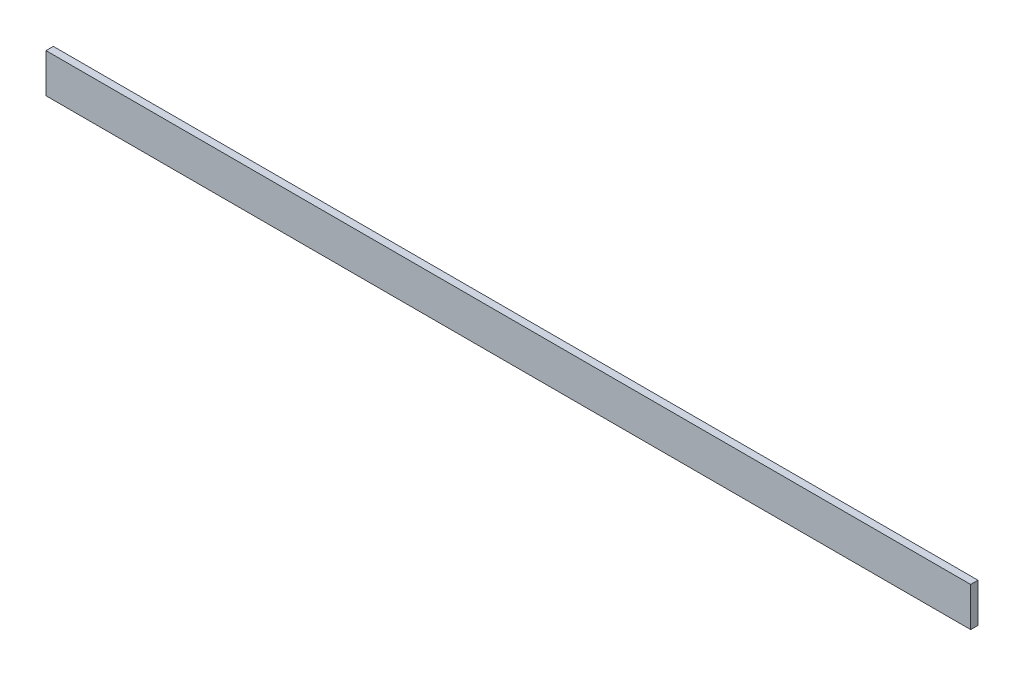
ISO-10303-21;
HEADER;
FILE_DESCRIPTION(('STEP AP214'),'2;1');
FILE_NAME('part.step','',(''),(''),'','','');
FILE_SCHEMA(('AUTOMOTIVE_DESIGN { 1 0 10303 214 1 1 1 1 }'));
ENDSEC;
DATA;
#1=APPLICATION_CONTEXT('core data for automotive mechanical design processes');
#2=APPLICATION_PROTOCOL_DEFINITION('international standard','automotive_design',2000,#1);
#3=PRODUCT_CONTEXT('',#1,'mechanical');
#4=PRODUCT('Part','Part','',(#3));
#5=PRODUCT_RELATED_PRODUCT_CATEGORY('part','',(#4));
#6=PRODUCT_DEFINITION_FORMATION('','',#4);
#7=PRODUCT_DEFINITION_CONTEXT('part definition',#1,'design');
#8=PRODUCT_DEFINITION('design','',#6,#7);
#9=PRODUCT_DEFINITION_SHAPE('','',#8);
#10=(LENGTH_UNIT() NAMED_UNIT(*) SI_UNIT(.MILLI.,.METRE.));
#11=(NAMED_UNIT(*) PLANE_ANGLE_UNIT() SI_UNIT($,.RADIAN.));
#12=(NAMED_UNIT(*) SI_UNIT($,.STERADIAN.) SOLID_ANGLE_UNIT());
#13=UNCERTAINTY_MEASURE_WITH_UNIT(LENGTH_MEASURE(1.E-05),#10,'distance_accuracy_value','');
#14=(GEOMETRIC_REPRESENTATION_CONTEXT(3) GLOBAL_UNCERTAINTY_ASSIGNED_CONTEXT((#13)) GLOBAL_UNIT_ASSIGNED_CONTEXT((#10,
#11,#12)) REPRESENTATION_CONTEXT('',''));
#15=CARTESIAN_POINT('',(0.,0.,0.));
#16=DIRECTION('',(0.,0.,1.));
#17=DIRECTION('',(1.,0.,0.));
#18=AXIS2_PLACEMENT_3D('',#15,#16,#17);
#19=CARTESIAN_POINT('',(1200.15,-50.7999999999997,19.05));
#20=DIRECTION('',(-1.,0.,0.));
#21=DIRECTION('',(0.,0.,1.));
#22=AXIS2_PLACEMENT_3D('',#19,#20,#21);
#23=PLANE('',#22);
#24=DIRECTION('',(0.,1.,0.));
#25=VECTOR('',#24,1.);
#26=CARTESIAN_POINT('',(1200.15,-50.7999999999997,0.));
#27=LINE('',#26,#25);
#28=CARTESIAN_POINT('',(1200.15,-50.7999999999997,0.));
#29=VERTEX_POINT('',#28);
#30=CARTESIAN_POINT('',(1200.15,50.8000000000002,0.));
#31=VERTEX_POINT('',#30);
#32=EDGE_CURVE('E96',#29,#31,#27,.T.);
#33=ORIENTED_EDGE('',*,*,#32,.T.);
#34=DIRECTION('',(0.,0.,-1.));
#35=VECTOR('',#34,1.);
#36=CARTESIAN_POINT('',(1200.15,50.8000000000002,19.05));
#37=LINE('',#36,#35);
#38=CARTESIAN_POINT('',(1200.15,50.8000000000002,19.05));
#39=VERTEX_POINT('',#38);
#40=EDGE_CURVE('E11',#39,#31,#37,.T.);
#41=ORIENTED_EDGE('',*,*,#40,.F.);
#42=DIRECTION('',(0.,1.,0.));
#43=VECTOR('',#42,1.);
#44=CARTESIAN_POINT('',(1200.15,-50.7999999999997,19.05));
#45=LINE('',#44,#43);
#46=CARTESIAN_POINT('',(1200.15,-50.7999999999997,19.05));
#47=VERTEX_POINT('',#46);
#48=EDGE_CURVE('E84',#47,#39,#45,.T.);
#49=ORIENTED_EDGE('',*,*,#48,.F.);
#50=DIRECTION('',(0.,0.,-1.));
#51=VECTOR('',#50,1.);
#52=CARTESIAN_POINT('',(1200.15,-50.7999999999997,19.05));
#53=LINE('',#52,#51);
#54=EDGE_CURVE('E92',#47,#29,#53,.T.);
#55=ORIENTED_EDGE('',*,*,#54,.T.);
#56=EDGE_LOOP('',(#33,#41,#49,#55));
#57=FACE_BOUND('',#56,.T.);
#58=ADVANCED_FACE('F33',(#57),#23,.F.);
#59=CARTESIAN_POINT('',(-1200.15,50.8000000000002,19.05));
#60=DIRECTION('',(0.,-1.,0.));
#61=DIRECTION('',(0.,0.,-1.));
#62=AXIS2_PLACEMENT_3D('',#59,#60,#61);
#63=PLANE('',#62);
#64=DIRECTION('',(-1.,0.,0.));
#65=VECTOR('',#64,1.);
#66=CARTESIAN_POINT('',(-1200.15,50.8000000000002,0.));
#67=LINE('',#66,#65);
#68=CARTESIAN_POINT('',(-1200.15,50.8000000000002,0.));
#69=VERTEX_POINT('',#68);
#70=EDGE_CURVE('E88',#31,#69,#67,.T.);
#71=ORIENTED_EDGE('',*,*,#70,.T.);
#72=DIRECTION('',(0.,0.,-1.));
#73=VECTOR('',#72,1.);
#74=CARTESIAN_POINT('',(-1200.15,50.8000000000002,19.05));
#75=LINE('',#74,#73);
#76=CARTESIAN_POINT('',(-1200.15,50.8000000000002,19.05));
#77=VERTEX_POINT('',#76);
#78=EDGE_CURVE('E41',#77,#69,#75,.T.);
#79=ORIENTED_EDGE('',*,*,#78,.F.);
#80=DIRECTION('',(-1.,0.,0.));
#81=VECTOR('',#80,1.);
#82=CARTESIAN_POINT('',(-1200.15,50.8000000000002,19.05));
#83=LINE('',#82,#81);
#84=EDGE_CURVE('E79',#39,#77,#83,.T.);
#85=ORIENTED_EDGE('',*,*,#84,.F.);
#86=ORIENTED_EDGE('',*,*,#40,.T.);
#87=EDGE_LOOP('',(#71,#79,#85,#86));
#88=FACE_BOUND('',#87,.T.);
#89=ADVANCED_FACE('F87',(#88),#63,.F.);
#90=CARTESIAN_POINT('',(-1200.15,-50.7999999999997,19.05));
#91=DIRECTION('',(1.,0.,0.));
#92=DIRECTION('',(0.,0.,-1.));
#93=AXIS2_PLACEMENT_3D('',#90,#91,#92);
#94=PLANE('',#93);
#95=DIRECTION('',(0.,-1.,0.));
#96=VECTOR('',#95,1.);
#97=CARTESIAN_POINT('',(-1200.15,-50.7999999999997,0.));
#98=LINE('',#97,#96);
#99=CARTESIAN_POINT('',(-1200.15,-50.7999999999997,0.));
#100=VERTEX_POINT('',#99);
#101=EDGE_CURVE('E66',#69,#100,#98,.T.);
#102=ORIENTED_EDGE('',*,*,#101,.T.);
#103=DIRECTION('',(0.,0.,-1.));
#104=VECTOR('',#103,1.);
#105=CARTESIAN_POINT('',(-1200.15,-50.7999999999997,19.05));
#106=LINE('',#105,#104);
#107=CARTESIAN_POINT('',(-1200.15,-50.7999999999997,19.05));
#108=VERTEX_POINT('',#107);
#109=EDGE_CURVE('E89',#108,#100,#106,.T.);
#110=ORIENTED_EDGE('',*,*,#109,.F.);
#111=DIRECTION('',(0.,-1.,0.));
#112=VECTOR('',#111,1.);
#113=CARTESIAN_POINT('',(-1200.15,-50.7999999999997,19.05));
#114=LINE('',#113,#112);
#115=EDGE_CURVE('E82',#77,#108,#114,.T.);
#116=ORIENTED_EDGE('',*,*,#115,.F.);
#117=ORIENTED_EDGE('',*,*,#78,.T.);
#118=EDGE_LOOP('',(#102,#110,#116,#117));
#119=FACE_BOUND('',#118,.T.);
#120=ADVANCED_FACE('F90',(#119),#94,.F.);
#121=CARTESIAN_POINT('',(-1200.15,-50.7999999999997,19.05));
#122=DIRECTION('',(0.,1.,0.));
#123=DIRECTION('',(0.,0.,1.));
#124=AXIS2_PLACEMENT_3D('',#121,#122,#123);
#125=PLANE('',#124);
#126=DIRECTION('',(1.,0.,0.));
#127=VECTOR('',#126,1.);
#128=CARTESIAN_POINT('',(-1200.15,-50.7999999999997,0.));
#129=LINE('',#128,#127);
#130=EDGE_CURVE('E72',#100,#29,#129,.T.);
#131=ORIENTED_EDGE('',*,*,#130,.T.);
#132=ORIENTED_EDGE('',*,*,#54,.F.);
#133=DIRECTION('',(1.,0.,0.));
#134=VECTOR('',#133,1.);
#135=CARTESIAN_POINT('',(-1200.15,-50.7999999999997,19.05));
#136=LINE('',#135,#134);
#137=EDGE_CURVE('E49',#108,#47,#136,.T.);
#138=ORIENTED_EDGE('',*,*,#137,.F.);
#139=ORIENTED_EDGE('',*,*,#109,.T.);
#140=EDGE_LOOP('',(#131,#132,#138,#139));
#141=FACE_BOUND('',#140,.T.);
#142=ADVANCED_FACE('F103',(#141),#125,.F.);
#143=CARTESIAN_POINT('',(0.,0.,19.05));
#144=DIRECTION('',(0.,0.,-1.));
#145=DIRECTION('',(-1.,0.,0.));
#146=AXIS2_PLACEMENT_3D('',#143,#144,#145);
#147=PLANE('',#146);
#148=ORIENTED_EDGE('',*,*,#48,.T.);
#149=ORIENTED_EDGE('',*,*,#84,.T.);
#150=ORIENTED_EDGE('',*,*,#115,.T.);
#151=ORIENTED_EDGE('',*,*,#137,.T.);
#152=EDGE_LOOP('',(#148,#149,#150,#151));
#153=FACE_BOUND('',#152,.T.);
#154=ADVANCED_FACE('F80',(#153),#147,.F.);
#155=CARTESIAN_POINT('',(0.,0.,0.));
#156=DIRECTION('',(0.,0.,-1.));
#157=DIRECTION('',(-1.,0.,0.));
#158=AXIS2_PLACEMENT_3D('',#155,#156,#157);
#159=PLANE('',#158);
#160=ORIENTED_EDGE('',*,*,#32,.F.);
#161=ORIENTED_EDGE('',*,*,#130,.F.);
#162=ORIENTED_EDGE('',*,*,#101,.F.);
#163=ORIENTED_EDGE('',*,*,#70,.F.);
#164=EDGE_LOOP('',(#160,#161,#162,#163));
#165=FACE_BOUND('',#164,.T.);
#166=ADVANCED_FACE('F106',(#165),#159,.T.);
#167=CLOSED_SHELL('',(#58,#89,#120,#142,#154,#166));
#168=MANIFOLD_SOLID_BREP('B2',#167);
#169=ADVANCED_BREP_SHAPE_REPRESENTATION('',(#18,#168),#14);
#170=SHAPE_DEFINITION_REPRESENTATION(#9,#169);
ENDSEC;
END-ISO-10303-21;
